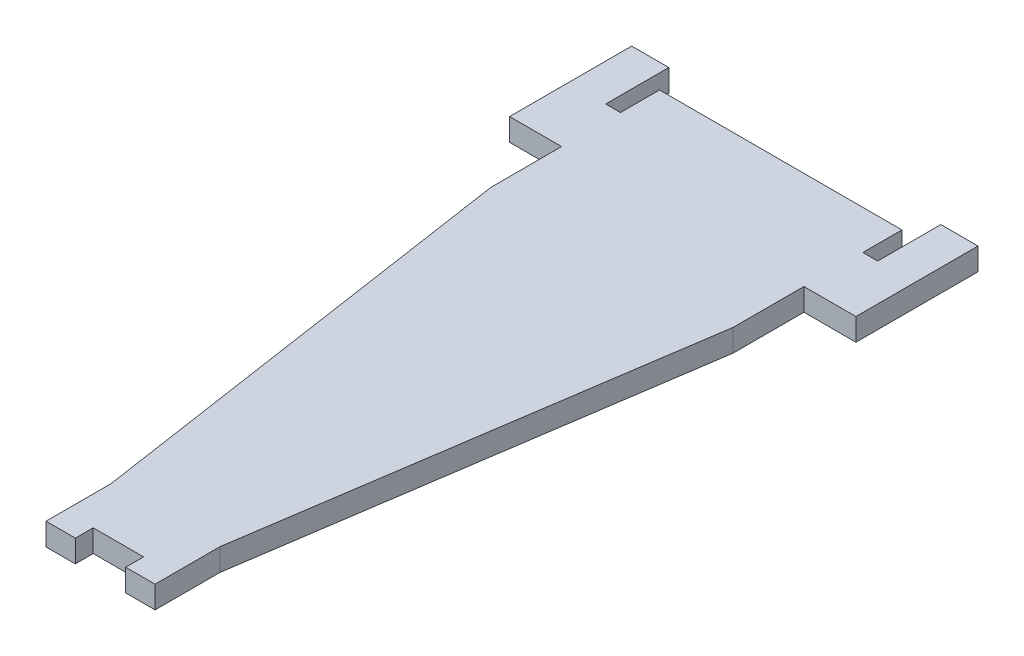
ISO-10303-21;
HEADER;
FILE_DESCRIPTION(('STEP AP214'),'2;1');
FILE_NAME('part.step','',(''),(''),'','','');
FILE_SCHEMA(('AUTOMOTIVE_DESIGN { 1 0 10303 214 1 1 1 1 }'));
ENDSEC;
DATA;
#1=APPLICATION_CONTEXT('core data for automotive mechanical design processes');
#2=APPLICATION_PROTOCOL_DEFINITION('international standard','automotive_design',2000,#1);
#3=PRODUCT_CONTEXT('',#1,'mechanical');
#4=PRODUCT('Part','Part','',(#3));
#5=PRODUCT_RELATED_PRODUCT_CATEGORY('part','',(#4));
#6=PRODUCT_DEFINITION_FORMATION('','',#4);
#7=PRODUCT_DEFINITION_CONTEXT('part definition',#1,'design');
#8=PRODUCT_DEFINITION('design','',#6,#7);
#9=PRODUCT_DEFINITION_SHAPE('','',#8);
#10=(LENGTH_UNIT() NAMED_UNIT(*) SI_UNIT(.MILLI.,.METRE.));
#11=(NAMED_UNIT(*) PLANE_ANGLE_UNIT() SI_UNIT($,.RADIAN.));
#12=(NAMED_UNIT(*) SI_UNIT($,.STERADIAN.) SOLID_ANGLE_UNIT());
#13=UNCERTAINTY_MEASURE_WITH_UNIT(LENGTH_MEASURE(1.E-05),#10,'distance_accuracy_value','');
#14=(GEOMETRIC_REPRESENTATION_CONTEXT(3) GLOBAL_UNCERTAINTY_ASSIGNED_CONTEXT((#13)) GLOBAL_UNIT_ASSIGNED_CONTEXT((#10,
#11,#12)) REPRESENTATION_CONTEXT('',''));
#15=CARTESIAN_POINT('',(0.,0.,0.));
#16=DIRECTION('',(0.,0.,1.));
#17=DIRECTION('',(1.,0.,0.));
#18=AXIS2_PLACEMENT_3D('',#15,#16,#17);
#19=CARTESIAN_POINT('',(65.7711044655571,0.35,-124.980144878676));
#20=DIRECTION('',(-1.,0.,0.));
#21=DIRECTION('',(0.,0.,1.));
#22=AXIS2_PLACEMENT_3D('',#19,#20,#21);
#23=PLANE('',#22);
#24=DIRECTION('',(0.,0.,-1.));
#25=VECTOR('',#24,1.);
#26=CARTESIAN_POINT('',(65.7711044655571,0.,-124.980144878676));
#27=LINE('',#26,#25);
#28=CARTESIAN_POINT('',(65.7711044655571,0.,-124.980144878676));
#29=VERTEX_POINT('',#28);
#30=CARTESIAN_POINT('',(65.7711044655571,0.,-125.998516086058));
#31=VERTEX_POINT('',#30);
#32=EDGE_CURVE('E276',#29,#31,#27,.T.);
#33=ORIENTED_EDGE('',*,*,#32,.T.);
#34=DIRECTION('',(0.,-1.,0.));
#35=VECTOR('',#34,1.);
#36=CARTESIAN_POINT('',(65.7711044655571,0.35,-125.998516086058));
#37=LINE('',#36,#35);
#38=CARTESIAN_POINT('',(65.7711044655571,0.35,-125.998516086058));
#39=VERTEX_POINT('',#38);
#40=EDGE_CURVE('E11',#39,#31,#37,.T.);
#41=ORIENTED_EDGE('',*,*,#40,.F.);
#42=DIRECTION('',(0.,0.,-1.));
#43=VECTOR('',#42,1.);
#44=CARTESIAN_POINT('',(65.7711044655571,0.35,-124.980144878676));
#45=LINE('',#44,#43);
#46=CARTESIAN_POINT('',(65.7711044655571,0.35,-124.980144878676));
#47=VERTEX_POINT('',#46);
#48=EDGE_CURVE('E341',#47,#39,#45,.T.);
#49=ORIENTED_EDGE('',*,*,#48,.F.);
#50=DIRECTION('',(0.,-1.,0.));
#51=VECTOR('',#50,1.);
#52=CARTESIAN_POINT('',(65.7711044655571,0.35,-124.980144878676));
#53=LINE('',#52,#51);
#54=EDGE_CURVE('E272',#47,#29,#53,.T.);
#55=ORIENTED_EDGE('',*,*,#54,.T.);
#56=EDGE_LOOP('',(#33,#41,#49,#55));
#57=FACE_BOUND('',#56,.T.);
#58=ADVANCED_FACE('F40',(#57),#23,.F.);
#59=CARTESIAN_POINT('',(65.7711044655571,0.35,-125.998516086058));
#60=DIRECTION('',(-0.989039748237034,0.,-0.147649505272537));
#61=DIRECTION('',(-0.147649505272537,0.,0.989039748237034));
#62=AXIS2_PLACEMENT_3D('',#59,#60,#61);
#63=PLANE('',#62);
#64=DIRECTION('',(0.147649505272537,0.,-0.989039748237034));
#65=VECTOR('',#64,1.);
#66=CARTESIAN_POINT('',(65.7711044655571,0.,-125.998516086058));
#67=LINE('',#66,#65);
#68=CARTESIAN_POINT('',(66.8161044655571,0.,-132.998516086058));
#69=VERTEX_POINT('',#68);
#70=EDGE_CURVE('E280',#31,#69,#67,.T.);
#71=ORIENTED_EDGE('',*,*,#70,.T.);
#72=DIRECTION('',(0.,-1.,0.));
#73=VECTOR('',#72,1.);
#74=CARTESIAN_POINT('',(66.8161044655571,0.35,-132.998516086058));
#75=LINE('',#74,#73);
#76=CARTESIAN_POINT('',(66.8161044655571,0.35,-132.998516086058));
#77=VERTEX_POINT('',#76);
#78=EDGE_CURVE('E49',#77,#69,#75,.T.);
#79=ORIENTED_EDGE('',*,*,#78,.F.);
#80=DIRECTION('',(0.147649505272537,0.,-0.989039748237034));
#81=VECTOR('',#80,1.);
#82=CARTESIAN_POINT('',(65.7711044655571,0.35,-125.998516086058));
#83=LINE('',#82,#81);
#84=EDGE_CURVE('E171',#39,#77,#83,.T.);
#85=ORIENTED_EDGE('',*,*,#84,.F.);
#86=ORIENTED_EDGE('',*,*,#40,.T.);
#87=EDGE_LOOP('',(#71,#79,#85,#86));
#88=FACE_BOUND('',#87,.T.);
#89=ADVANCED_FACE('F494',(#88),#63,.F.);
#90=CARTESIAN_POINT('',(66.8161044655571,0.35,-134.108516086058));
#91=DIRECTION('',(-1.,0.,0.));
#92=DIRECTION('',(0.,0.,1.));
#93=AXIS2_PLACEMENT_3D('',#90,#91,#92);
#94=PLANE('',#93);
#95=DIRECTION('',(0.,0.,-1.));
#96=VECTOR('',#95,1.);
#97=CARTESIAN_POINT('',(66.8161044655571,0.,-134.108516086058));
#98=LINE('',#97,#96);
#99=CARTESIAN_POINT('',(66.8161044655571,0.,-134.108516086058));
#100=VERTEX_POINT('',#99);
#101=EDGE_CURVE('E283',#69,#100,#98,.T.);
#102=ORIENTED_EDGE('',*,*,#101,.T.);
#103=DIRECTION('',(0.,-1.,0.));
#104=VECTOR('',#103,1.);
#105=CARTESIAN_POINT('',(66.8161044655571,0.35,-134.108516086058));
#106=LINE('',#105,#104);
#107=CARTESIAN_POINT('',(66.8161044655571,0.35,-134.108516086058));
#108=VERTEX_POINT('',#107);
#109=EDGE_CURVE('E411',#108,#100,#106,.T.);
#110=ORIENTED_EDGE('',*,*,#109,.F.);
#111=DIRECTION('',(0.,0.,-1.));
#112=VECTOR('',#111,1.);
#113=CARTESIAN_POINT('',(66.8161044655571,0.35,-134.108516086058));
#114=LINE('',#113,#112);
#115=EDGE_CURVE('E421',#77,#108,#114,.T.);
#116=ORIENTED_EDGE('',*,*,#115,.F.);
#117=ORIENTED_EDGE('',*,*,#78,.T.);
#118=EDGE_LOOP('',(#102,#110,#116,#117));
#119=FACE_BOUND('',#118,.T.);
#120=ADVANCED_FACE('F419',(#119),#94,.F.);
#121=CARTESIAN_POINT('',(66.8161044655571,0.35,-134.108516086058));
#122=DIRECTION('',(0.,0.,-1.));
#123=DIRECTION('',(-1.,0.,0.));
#124=AXIS2_PLACEMENT_3D('',#121,#122,#123);
#125=PLANE('',#124);
#126=DIRECTION('',(1.,0.,0.));
#127=VECTOR('',#126,1.);
#128=CARTESIAN_POINT('',(66.8161044655571,0.,-134.108516086058));
#129=LINE('',#128,#127);
#130=CARTESIAN_POINT('',(67.6310057872198,0.,-134.108516086058));
#131=VERTEX_POINT('',#130);
#132=EDGE_CURVE('E286',#100,#131,#129,.T.);
#133=ORIENTED_EDGE('',*,*,#132,.T.);
#134=DIRECTION('',(0.,-1.,0.));
#135=VECTOR('',#134,1.);
#136=CARTESIAN_POINT('',(67.6310057872198,0.35,-134.108516086058));
#137=LINE('',#136,#135);
#138=CARTESIAN_POINT('',(67.6310057872198,0.35,-134.108516086058));
#139=VERTEX_POINT('',#138);
#140=EDGE_CURVE('E407',#139,#131,#137,.T.);
#141=ORIENTED_EDGE('',*,*,#140,.F.);
#142=DIRECTION('',(1.,0.,0.));
#143=VECTOR('',#142,1.);
#144=CARTESIAN_POINT('',(66.8161044655571,0.35,-134.108516086058));
#145=LINE('',#144,#143);
#146=EDGE_CURVE('E440',#108,#139,#145,.T.);
#147=ORIENTED_EDGE('',*,*,#146,.F.);
#148=ORIENTED_EDGE('',*,*,#109,.T.);
#149=EDGE_LOOP('',(#133,#141,#147,#148));
#150=FACE_BOUND('',#149,.T.);
#151=ADVANCED_FACE('F430',(#150),#125,.F.);
#152=CARTESIAN_POINT('',(67.6310057872198,0.35,-136.022566647931));
#153=DIRECTION('',(-1.,0.,0.));
#154=DIRECTION('',(0.,0.,1.));
#155=AXIS2_PLACEMENT_3D('',#152,#153,#154);
#156=PLANE('',#155);
#157=DIRECTION('',(0.,0.,-1.));
#158=VECTOR('',#157,1.);
#159=CARTESIAN_POINT('',(67.6310057872198,0.,-136.022566647931));
#160=LINE('',#159,#158);
#161=CARTESIAN_POINT('',(67.6310057872198,0.,-136.022566647931));
#162=VERTEX_POINT('',#161);
#163=EDGE_CURVE('E289',#131,#162,#160,.T.);
#164=ORIENTED_EDGE('',*,*,#163,.T.);
#165=DIRECTION('',(0.,-1.,0.));
#166=VECTOR('',#165,1.);
#167=CARTESIAN_POINT('',(67.6310057872198,0.35,-136.022566647931));
#168=LINE('',#167,#166);
#169=CARTESIAN_POINT('',(67.6310057872198,0.35,-136.022566647931));
#170=VERTEX_POINT('',#169);
#171=EDGE_CURVE('E403',#170,#162,#168,.T.);
#172=ORIENTED_EDGE('',*,*,#171,.F.);
#173=DIRECTION('',(0.,0.,-1.));
#174=VECTOR('',#173,1.);
#175=CARTESIAN_POINT('',(67.6310057872198,0.35,-136.022566647931));
#176=LINE('',#175,#174);
#177=EDGE_CURVE('E436',#139,#170,#176,.T.);
#178=ORIENTED_EDGE('',*,*,#177,.F.);
#179=ORIENTED_EDGE('',*,*,#140,.T.);
#180=EDGE_LOOP('',(#164,#172,#178,#179));
#181=FACE_BOUND('',#180,.T.);
#182=ADVANCED_FACE('F434',(#181),#156,.F.);
#183=CARTESIAN_POINT('',(67.0486280438197,0.35,-136.022566647931));
#184=DIRECTION('',(0.,0.,1.));
#185=DIRECTION('',(1.,0.,0.));
#186=AXIS2_PLACEMENT_3D('',#183,#184,#185);
#187=PLANE('',#186);
#188=DIRECTION('',(-1.,0.,0.));
#189=VECTOR('',#188,1.);
#190=CARTESIAN_POINT('',(67.0486280438197,0.,-136.022566647931));
#191=LINE('',#190,#189);
#192=CARTESIAN_POINT('',(67.0486280438197,0.,-136.022566647931));
#193=VERTEX_POINT('',#192);
#194=EDGE_CURVE('E292',#162,#193,#191,.T.);
#195=ORIENTED_EDGE('',*,*,#194,.T.);
#196=DIRECTION('',(0.,-1.,0.));
#197=VECTOR('',#196,1.);
#198=CARTESIAN_POINT('',(67.0486280438197,0.35,-136.022566647931));
#199=LINE('',#198,#197);
#200=CARTESIAN_POINT('',(67.0486280438197,0.35,-136.022566647931));
#201=VERTEX_POINT('',#200);
#202=EDGE_CURVE('E399',#201,#193,#199,.T.);
#203=ORIENTED_EDGE('',*,*,#202,.F.);
#204=DIRECTION('',(-1.,0.,0.));
#205=VECTOR('',#204,1.);
#206=CARTESIAN_POINT('',(67.0486280438197,0.35,-136.022566647931));
#207=LINE('',#206,#205);
#208=EDGE_CURVE('E439',#170,#201,#207,.T.);
#209=ORIENTED_EDGE('',*,*,#208,.F.);
#210=ORIENTED_EDGE('',*,*,#171,.T.);
#211=EDGE_LOOP('',(#195,#203,#209,#210));
#212=FACE_BOUND('',#211,.T.);
#213=ADVANCED_FACE('F506',(#212),#187,.F.);
#214=CARTESIAN_POINT('',(67.0486280438197,0.35,-135.031947543574));
#215=DIRECTION('',(1.,0.,0.));
#216=DIRECTION('',(0.,0.,-1.));
#217=AXIS2_PLACEMENT_3D('',#214,#215,#216);
#218=PLANE('',#217);
#219=DIRECTION('',(0.,0.,1.));
#220=VECTOR('',#219,1.);
#221=CARTESIAN_POINT('',(67.0486280438197,0.,-135.031947543574));
#222=LINE('',#221,#220);
#223=CARTESIAN_POINT('',(67.0486280438197,0.,-135.031947543574));
#224=VERTEX_POINT('',#223);
#225=EDGE_CURVE('E295',#193,#224,#222,.T.);
#226=ORIENTED_EDGE('',*,*,#225,.T.);
#227=DIRECTION('',(0.,-1.,0.));
#228=VECTOR('',#227,1.);
#229=CARTESIAN_POINT('',(67.0486280438197,0.35,-135.031947543574));
#230=LINE('',#229,#228);
#231=CARTESIAN_POINT('',(67.0486280438197,0.35,-135.031947543574));
#232=VERTEX_POINT('',#231);
#233=EDGE_CURVE('E395',#232,#224,#230,.T.);
#234=ORIENTED_EDGE('',*,*,#233,.F.);
#235=DIRECTION('',(0.,0.,1.));
#236=VECTOR('',#235,1.);
#237=CARTESIAN_POINT('',(67.0486280438197,0.35,-135.031947543574));
#238=LINE('',#237,#236);
#239=EDGE_CURVE('E444',#201,#232,#238,.T.);
#240=ORIENTED_EDGE('',*,*,#239,.F.);
#241=ORIENTED_EDGE('',*,*,#202,.T.);
#242=EDGE_LOOP('',(#226,#234,#240,#241));
#243=FACE_BOUND('',#242,.T.);
#244=ADVANCED_FACE('F509',(#243),#218,.F.);
#245=CARTESIAN_POINT('',(66.8161044655571,0.35,-135.031947543574));
#246=DIRECTION('',(0.,0.,1.));
#247=DIRECTION('',(1.,0.,0.));
#248=AXIS2_PLACEMENT_3D('',#245,#246,#247);
#249=PLANE('',#248);
#250=DIRECTION('',(-1.,0.,0.));
#251=VECTOR('',#250,1.);
#252=CARTESIAN_POINT('',(66.8161044655571,0.,-135.031947543574));
#253=LINE('',#252,#251);
#254=CARTESIAN_POINT('',(66.8161044655571,0.,-135.031947543574));
#255=VERTEX_POINT('',#254);
#256=EDGE_CURVE('E298',#224,#255,#253,.T.);
#257=ORIENTED_EDGE('',*,*,#256,.T.);
#258=DIRECTION('',(0.,-1.,0.));
#259=VECTOR('',#258,1.);
#260=CARTESIAN_POINT('',(66.8161044655571,0.35,-135.031947543574));
#261=LINE('',#260,#259);
#262=CARTESIAN_POINT('',(66.8161044655571,0.35,-135.031947543574));
#263=VERTEX_POINT('',#262);
#264=EDGE_CURVE('E391',#263,#255,#261,.T.);
#265=ORIENTED_EDGE('',*,*,#264,.F.);
#266=DIRECTION('',(-1.,0.,0.));
#267=VECTOR('',#266,1.);
#268=CARTESIAN_POINT('',(66.8161044655571,0.35,-135.031947543574));
#269=LINE('',#268,#267);
#270=EDGE_CURVE('E451',#232,#263,#269,.T.);
#271=ORIENTED_EDGE('',*,*,#270,.F.);
#272=ORIENTED_EDGE('',*,*,#233,.T.);
#273=EDGE_LOOP('',(#257,#265,#271,#272));
#274=FACE_BOUND('',#273,.T.);
#275=ADVANCED_FACE('F513',(#274),#249,.F.);
#276=CARTESIAN_POINT('',(66.8161044655571,0.35,-135.644718333563));
#277=DIRECTION('',(-1.,0.,0.));
#278=DIRECTION('',(0.,0.,1.));
#279=AXIS2_PLACEMENT_3D('',#276,#277,#278);
#280=PLANE('',#279);
#281=DIRECTION('',(0.,0.,-1.));
#282=VECTOR('',#281,1.);
#283=CARTESIAN_POINT('',(66.8161044655571,0.,-135.644718333563));
#284=LINE('',#283,#282);
#285=CARTESIAN_POINT('',(66.8161044655571,0.,-135.644718333563));
#286=VERTEX_POINT('',#285);
#287=EDGE_CURVE('E301',#255,#286,#284,.T.);
#288=ORIENTED_EDGE('',*,*,#287,.T.);
#289=DIRECTION('',(0.,-1.,0.));
#290=VECTOR('',#289,1.);
#291=CARTESIAN_POINT('',(66.8161044655571,0.35,-135.644718333563));
#292=LINE('',#291,#290);
#293=CARTESIAN_POINT('',(66.8161044655571,0.35,-135.644718333563));
#294=VERTEX_POINT('',#293);
#295=EDGE_CURVE('E387',#294,#286,#292,.T.);
#296=ORIENTED_EDGE('',*,*,#295,.F.);
#297=DIRECTION('',(0.,0.,-1.));
#298=VECTOR('',#297,1.);
#299=CARTESIAN_POINT('',(66.8161044655571,0.35,-135.644718333563));
#300=LINE('',#299,#298);
#301=EDGE_CURVE('E454',#263,#294,#300,.T.);
#302=ORIENTED_EDGE('',*,*,#301,.F.);
#303=ORIENTED_EDGE('',*,*,#264,.T.);
#304=EDGE_LOOP('',(#288,#296,#302,#303));
#305=FACE_BOUND('',#304,.T.);
#306=ADVANCED_FACE('F517',(#305),#280,.F.);
#307=CARTESIAN_POINT('',(63.0161044655571,0.35,-135.644718333563));
#308=DIRECTION('',(0.,0.,1.));
#309=DIRECTION('',(1.,0.,0.));
#310=AXIS2_PLACEMENT_3D('',#307,#308,#309);
#311=PLANE('',#310);
#312=DIRECTION('',(-1.,0.,0.));
#313=VECTOR('',#312,1.);
#314=CARTESIAN_POINT('',(63.0161044655571,0.,-135.644718333563));
#315=LINE('',#314,#313);
#316=CARTESIAN_POINT('',(63.0161044655571,0.,-135.644718333563));
#317=VERTEX_POINT('',#316);
#318=EDGE_CURVE('E304',#286,#317,#315,.T.);
#319=ORIENTED_EDGE('',*,*,#318,.T.);
#320=DIRECTION('',(0.,-1.,0.));
#321=VECTOR('',#320,1.);
#322=CARTESIAN_POINT('',(63.0161044655571,0.35,-135.644718333563));
#323=LINE('',#322,#321);
#324=CARTESIAN_POINT('',(63.0161044655571,0.35,-135.644718333563));
#325=VERTEX_POINT('',#324);
#326=EDGE_CURVE('E384',#325,#317,#323,.T.);
#327=ORIENTED_EDGE('',*,*,#326,.F.);
#328=DIRECTION('',(-1.,0.,0.));
#329=VECTOR('',#328,1.);
#330=CARTESIAN_POINT('',(63.0161044655571,0.35,-135.644718333563));
#331=LINE('',#330,#329);
#332=EDGE_CURVE('E457',#294,#325,#331,.T.);
#333=ORIENTED_EDGE('',*,*,#332,.F.);
#334=ORIENTED_EDGE('',*,*,#295,.T.);
#335=EDGE_LOOP('',(#319,#327,#333,#334));
#336=FACE_BOUND('',#335,.T.);
#337=ADVANCED_FACE('F521',(#336),#311,.F.);
#338=CARTESIAN_POINT('',(63.0161044655571,0.35,-135.031947543574));
#339=DIRECTION('',(1.,0.,0.));
#340=DIRECTION('',(0.,0.,-1.));
#341=AXIS2_PLACEMENT_3D('',#338,#339,#340);
#342=PLANE('',#341);
#343=DIRECTION('',(0.,0.,1.));
#344=VECTOR('',#343,1.);
#345=CARTESIAN_POINT('',(63.0161044655571,0.,-135.031947543574));
#346=LINE('',#345,#344);
#347=CARTESIAN_POINT('',(63.0161044655571,0.,-135.031947543574));
#348=VERTEX_POINT('',#347);
#349=EDGE_CURVE('E307',#317,#348,#346,.T.);
#350=ORIENTED_EDGE('',*,*,#349,.T.);
#351=DIRECTION('',(0.,-1.,0.));
#352=VECTOR('',#351,1.);
#353=CARTESIAN_POINT('',(63.0161044655571,0.35,-135.031947543574));
#354=LINE('',#353,#352);
#355=CARTESIAN_POINT('',(63.0161044655571,0.35,-135.031947543574));
#356=VERTEX_POINT('',#355);
#357=EDGE_CURVE('E381',#356,#348,#354,.T.);
#358=ORIENTED_EDGE('',*,*,#357,.F.);
#359=DIRECTION('',(0.,0.,1.));
#360=VECTOR('',#359,1.);
#361=CARTESIAN_POINT('',(63.0161044655571,0.35,-135.031947543574));
#362=LINE('',#361,#360);
#363=EDGE_CURVE('E460',#325,#356,#362,.T.);
#364=ORIENTED_EDGE('',*,*,#363,.F.);
#365=ORIENTED_EDGE('',*,*,#326,.T.);
#366=EDGE_LOOP('',(#350,#358,#364,#365));
#367=FACE_BOUND('',#366,.T.);
#368=ADVANCED_FACE('F525',(#367),#342,.F.);
#369=CARTESIAN_POINT('',(62.7835808872946,0.35,-135.031947543574));
#370=DIRECTION('',(0.,0.,1.));
#371=DIRECTION('',(1.,0.,0.));
#372=AXIS2_PLACEMENT_3D('',#369,#370,#371);
#373=PLANE('',#372);
#374=DIRECTION('',(-1.,0.,0.));
#375=VECTOR('',#374,1.);
#376=CARTESIAN_POINT('',(62.7835808872946,0.,-135.031947543574));
#377=LINE('',#376,#375);
#378=CARTESIAN_POINT('',(62.7835808872946,0.,-135.031947543574));
#379=VERTEX_POINT('',#378);
#380=EDGE_CURVE('E309',#348,#379,#377,.T.);
#381=ORIENTED_EDGE('',*,*,#380,.T.);
#382=DIRECTION('',(0.,-1.,0.));
#383=VECTOR('',#382,1.);
#384=CARTESIAN_POINT('',(62.7835808872946,0.35,-135.031947543574));
#385=LINE('',#384,#383);
#386=CARTESIAN_POINT('',(62.7835808872946,0.35,-135.031947543574));
#387=VERTEX_POINT('',#386);
#388=EDGE_CURVE('E378',#387,#379,#385,.T.);
#389=ORIENTED_EDGE('',*,*,#388,.F.);
#390=DIRECTION('',(-1.,0.,0.));
#391=VECTOR('',#390,1.);
#392=CARTESIAN_POINT('',(62.7835808872946,0.35,-135.031947543574));
#393=LINE('',#392,#391);
#394=EDGE_CURVE('E462',#356,#387,#393,.T.);
#395=ORIENTED_EDGE('',*,*,#394,.F.);
#396=ORIENTED_EDGE('',*,*,#357,.T.);
#397=EDGE_LOOP('',(#381,#389,#395,#396));
#398=FACE_BOUND('',#397,.T.);
#399=ADVANCED_FACE('F529',(#398),#373,.F.);
#400=CARTESIAN_POINT('',(62.7835808872945,0.35,-136.022566647931));
#401=DIRECTION('',(-1.,0.,0.));
#402=DIRECTION('',(0.,0.,1.));
#403=AXIS2_PLACEMENT_3D('',#400,#401,#402);
#404=PLANE('',#403);
#405=DIRECTION('',(0.,0.,-1.));
#406=VECTOR('',#405,1.);
#407=CARTESIAN_POINT('',(62.7835808872945,0.,-136.022566647931));
#408=LINE('',#407,#406);
#409=CARTESIAN_POINT('',(62.7835808872945,0.,-136.022566647931));
#410=VERTEX_POINT('',#409);
#411=EDGE_CURVE('E311',#379,#410,#408,.T.);
#412=ORIENTED_EDGE('',*,*,#411,.T.);
#413=DIRECTION('',(0.,-1.,0.));
#414=VECTOR('',#413,1.);
#415=CARTESIAN_POINT('',(62.7835808872945,0.35,-136.022566647931));
#416=LINE('',#415,#414);
#417=CARTESIAN_POINT('',(62.7835808872945,0.35,-136.022566647931));
#418=VERTEX_POINT('',#417);
#419=EDGE_CURVE('E375',#418,#410,#416,.T.);
#420=ORIENTED_EDGE('',*,*,#419,.F.);
#421=DIRECTION('',(0.,0.,-1.));
#422=VECTOR('',#421,1.);
#423=CARTESIAN_POINT('',(62.7835808872945,0.35,-136.022566647931));
#424=LINE('',#423,#422);
#425=EDGE_CURVE('E464',#387,#418,#424,.T.);
#426=ORIENTED_EDGE('',*,*,#425,.F.);
#427=ORIENTED_EDGE('',*,*,#388,.T.);
#428=EDGE_LOOP('',(#412,#420,#426,#427));
#429=FACE_BOUND('',#428,.T.);
#430=ADVANCED_FACE('F533',(#429),#404,.F.);
#431=CARTESIAN_POINT('',(62.2012031438945,0.35,-136.022566647931));
#432=DIRECTION('',(0.,0.,1.));
#433=DIRECTION('',(1.,0.,0.));
#434=AXIS2_PLACEMENT_3D('',#431,#432,#433);
#435=PLANE('',#434);
#436=DIRECTION('',(-1.,0.,0.));
#437=VECTOR('',#436,1.);
#438=CARTESIAN_POINT('',(62.2012031438945,0.,-136.022566647931));
#439=LINE('',#438,#437);
#440=CARTESIAN_POINT('',(62.2012031438945,0.,-136.022566647931));
#441=VERTEX_POINT('',#440);
#442=EDGE_CURVE('E313',#410,#441,#439,.T.);
#443=ORIENTED_EDGE('',*,*,#442,.T.);
#444=DIRECTION('',(0.,-1.,0.));
#445=VECTOR('',#444,1.);
#446=CARTESIAN_POINT('',(62.2012031438945,0.35,-136.022566647931));
#447=LINE('',#446,#445);
#448=CARTESIAN_POINT('',(62.2012031438945,0.35,-136.022566647931));
#449=VERTEX_POINT('',#448);
#450=EDGE_CURVE('E372',#449,#441,#447,.T.);
#451=ORIENTED_EDGE('',*,*,#450,.F.);
#452=DIRECTION('',(-1.,0.,0.));
#453=VECTOR('',#452,1.);
#454=CARTESIAN_POINT('',(62.2012031438945,0.35,-136.022566647931));
#455=LINE('',#454,#453);
#456=EDGE_CURVE('E466',#418,#449,#455,.T.);
#457=ORIENTED_EDGE('',*,*,#456,.F.);
#458=ORIENTED_EDGE('',*,*,#419,.T.);
#459=EDGE_LOOP('',(#443,#451,#457,#458));
#460=FACE_BOUND('',#459,.T.);
#461=ADVANCED_FACE('F537',(#460),#435,.F.);
#462=CARTESIAN_POINT('',(62.2012031438945,0.35,-136.022566647931));
#463=DIRECTION('',(1.,0.,0.));
#464=DIRECTION('',(0.,0.,-1.));
#465=AXIS2_PLACEMENT_3D('',#462,#463,#464);
#466=PLANE('',#465);
#467=DIRECTION('',(0.,0.,1.));
#468=VECTOR('',#467,1.);
#469=CARTESIAN_POINT('',(62.2012031438945,0.,-136.022566647931));
#470=LINE('',#469,#468);
#471=CARTESIAN_POINT('',(62.2012031438945,0.,-134.108516086058));
#472=VERTEX_POINT('',#471);
#473=EDGE_CURVE('E315',#441,#472,#470,.T.);
#474=ORIENTED_EDGE('',*,*,#473,.T.);
#475=DIRECTION('',(0.,-1.,0.));
#476=VECTOR('',#475,1.);
#477=CARTESIAN_POINT('',(62.2012031438945,0.35,-134.108516086058));
#478=LINE('',#477,#476);
#479=CARTESIAN_POINT('',(62.2012031438945,0.35,-134.108516086058));
#480=VERTEX_POINT('',#479);
#481=EDGE_CURVE('E368',#480,#472,#478,.T.);
#482=ORIENTED_EDGE('',*,*,#481,.F.);
#483=DIRECTION('',(0.,0.,1.));
#484=VECTOR('',#483,1.);
#485=CARTESIAN_POINT('',(62.2012031438945,0.35,-136.022566647931));
#486=LINE('',#485,#484);
#487=EDGE_CURVE('E468',#449,#480,#486,.T.);
#488=ORIENTED_EDGE('',*,*,#487,.F.);
#489=ORIENTED_EDGE('',*,*,#450,.T.);
#490=EDGE_LOOP('',(#474,#482,#488,#489));
#491=FACE_BOUND('',#490,.T.);
#492=ADVANCED_FACE('F541',(#491),#466,.F.);
#493=CARTESIAN_POINT('',(62.2012031438945,0.35,-134.108516086058));
#494=DIRECTION('',(0.,0.,-1.));
#495=DIRECTION('',(-1.,0.,0.));
#496=AXIS2_PLACEMENT_3D('',#493,#494,#495);
#497=PLANE('',#496);
#498=DIRECTION('',(1.,0.,0.));
#499=VECTOR('',#498,1.);
#500=CARTESIAN_POINT('',(62.2012031438945,0.,-134.108516086058));
#501=LINE('',#500,#499);
#502=CARTESIAN_POINT('',(63.0161044655571,0.,-134.108516086058));
#503=VERTEX_POINT('',#502);
#504=EDGE_CURVE('E318',#472,#503,#501,.T.);
#505=ORIENTED_EDGE('',*,*,#504,.T.);
#506=DIRECTION('',(0.,-1.,0.));
#507=VECTOR('',#506,1.);
#508=CARTESIAN_POINT('',(63.0161044655571,0.35,-134.108516086058));
#509=LINE('',#508,#507);
#510=CARTESIAN_POINT('',(63.0161044655571,0.35,-134.108516086058));
#511=VERTEX_POINT('',#510);
#512=EDGE_CURVE('E364',#511,#503,#509,.T.);
#513=ORIENTED_EDGE('',*,*,#512,.F.);
#514=DIRECTION('',(1.,0.,0.));
#515=VECTOR('',#514,1.);
#516=CARTESIAN_POINT('',(62.2012031438945,0.35,-134.108516086058));
#517=LINE('',#516,#515);
#518=EDGE_CURVE('E471',#480,#511,#517,.T.);
#519=ORIENTED_EDGE('',*,*,#518,.F.);
#520=ORIENTED_EDGE('',*,*,#481,.T.);
#521=EDGE_LOOP('',(#505,#513,#519,#520));
#522=FACE_BOUND('',#521,.T.);
#523=ADVANCED_FACE('F545',(#522),#497,.F.);
#524=CARTESIAN_POINT('',(63.0161044655571,0.35,-132.998516086058));
#525=DIRECTION('',(1.,0.,0.));
#526=DIRECTION('',(0.,0.,-1.));
#527=AXIS2_PLACEMENT_3D('',#524,#525,#526);
#528=PLANE('',#527);
#529=DIRECTION('',(0.,0.,1.));
#530=VECTOR('',#529,1.);
#531=CARTESIAN_POINT('',(63.0161044655571,0.,-132.998516086058));
#532=LINE('',#531,#530);
#533=CARTESIAN_POINT('',(63.0161044655571,0.,-132.998516086058));
#534=VERTEX_POINT('',#533);
#535=EDGE_CURVE('E321',#503,#534,#532,.T.);
#536=ORIENTED_EDGE('',*,*,#535,.T.);
#537=DIRECTION('',(0.,-1.,0.));
#538=VECTOR('',#537,1.);
#539=CARTESIAN_POINT('',(63.0161044655571,0.35,-132.998516086058));
#540=LINE('',#539,#538);
#541=CARTESIAN_POINT('',(63.0161044655571,0.35,-132.998516086058));
#542=VERTEX_POINT('',#541);
#543=EDGE_CURVE('E360',#542,#534,#540,.T.);
#544=ORIENTED_EDGE('',*,*,#543,.F.);
#545=DIRECTION('',(0.,0.,1.));
#546=VECTOR('',#545,1.);
#547=CARTESIAN_POINT('',(63.0161044655571,0.35,-132.998516086058));
#548=LINE('',#547,#546);
#549=EDGE_CURVE('E474',#511,#542,#548,.T.);
#550=ORIENTED_EDGE('',*,*,#549,.F.);
#551=ORIENTED_EDGE('',*,*,#512,.T.);
#552=EDGE_LOOP('',(#536,#544,#550,#551));
#553=FACE_BOUND('',#552,.T.);
#554=ADVANCED_FACE('F549',(#553),#528,.F.);
#555=CARTESIAN_POINT('',(63.0161044655571,0.35,-132.998516086058));
#556=DIRECTION('',(0.989039748237034,0.,-0.147649505272537));
#557=DIRECTION('',(-0.147649505272537,0.,-0.989039748237034));
#558=AXIS2_PLACEMENT_3D('',#555,#556,#557);
#559=PLANE('',#558);
#560=DIRECTION('',(0.147649505272537,0.,0.989039748237034));
#561=VECTOR('',#560,1.);
#562=CARTESIAN_POINT('',(63.0161044655571,0.,-132.998516086058));
#563=LINE('',#562,#561);
#564=CARTESIAN_POINT('',(64.0611044655572,0.,-125.998516086058));
#565=VERTEX_POINT('',#564);
#566=EDGE_CURVE('E324',#534,#565,#563,.T.);
#567=ORIENTED_EDGE('',*,*,#566,.T.);
#568=DIRECTION('',(0.,-1.,0.));
#569=VECTOR('',#568,1.);
#570=CARTESIAN_POINT('',(64.0611044655572,0.35,-125.998516086058));
#571=LINE('',#570,#569);
#572=CARTESIAN_POINT('',(64.0611044655572,0.35,-125.998516086058));
#573=VERTEX_POINT('',#572);
#574=EDGE_CURVE('E356',#573,#565,#571,.T.);
#575=ORIENTED_EDGE('',*,*,#574,.F.);
#576=DIRECTION('',(0.147649505272537,0.,0.989039748237034));
#577=VECTOR('',#576,1.);
#578=CARTESIAN_POINT('',(63.0161044655571,0.35,-132.998516086058));
#579=LINE('',#578,#577);
#580=EDGE_CURVE('E477',#542,#573,#579,.T.);
#581=ORIENTED_EDGE('',*,*,#580,.F.);
#582=ORIENTED_EDGE('',*,*,#543,.T.);
#583=EDGE_LOOP('',(#567,#575,#581,#582));
#584=FACE_BOUND('',#583,.T.);
#585=ADVANCED_FACE('F553',(#584),#559,.F.);
#586=CARTESIAN_POINT('',(64.0611044655572,0.35,-125.998516086058));
#587=DIRECTION('',(1.,0.,0.));
#588=DIRECTION('',(0.,0.,-1.));
#589=AXIS2_PLACEMENT_3D('',#586,#587,#588);
#590=PLANE('',#589);
#591=DIRECTION('',(0.,0.,1.));
#592=VECTOR('',#591,1.);
#593=CARTESIAN_POINT('',(64.0611044655572,0.,-125.998516086058));
#594=LINE('',#593,#592);
#595=CARTESIAN_POINT('',(64.0611044655572,0.,-124.980144878676));
#596=VERTEX_POINT('',#595);
#597=EDGE_CURVE('E327',#565,#596,#594,.T.);
#598=ORIENTED_EDGE('',*,*,#597,.T.);
#599=DIRECTION('',(0.,-1.,0.));
#600=VECTOR('',#599,1.);
#601=CARTESIAN_POINT('',(64.0611044655572,0.35,-124.980144878676));
#602=LINE('',#601,#600);
#603=CARTESIAN_POINT('',(64.0611044655572,0.35,-124.980144878676));
#604=VERTEX_POINT('',#603);
#605=EDGE_CURVE('E352',#604,#596,#602,.T.);
#606=ORIENTED_EDGE('',*,*,#605,.F.);
#607=DIRECTION('',(0.,0.,1.));
#608=VECTOR('',#607,1.);
#609=CARTESIAN_POINT('',(64.0611044655572,0.35,-125.998516086058));
#610=LINE('',#609,#608);
#611=EDGE_CURVE('E480',#573,#604,#610,.T.);
#612=ORIENTED_EDGE('',*,*,#611,.F.);
#613=ORIENTED_EDGE('',*,*,#574,.T.);
#614=EDGE_LOOP('',(#598,#606,#612,#613));
#615=FACE_BOUND('',#614,.T.);
#616=ADVANCED_FACE('F557',(#615),#590,.F.);
#617=CARTESIAN_POINT('',(64.0611044655572,0.35,-124.980144878676));
#618=DIRECTION('',(0.,0.,-1.));
#619=DIRECTION('',(-1.,0.,0.));
#620=AXIS2_PLACEMENT_3D('',#617,#618,#619);
#621=PLANE('',#620);
#622=DIRECTION('',(1.,0.,0.));
#623=VECTOR('',#622,1.);
#624=CARTESIAN_POINT('',(64.0611044655572,0.,-124.980144878676));
#625=LINE('',#624,#623);
#626=CARTESIAN_POINT('',(64.5211044655571,0.,-124.980144878676));
#627=VERTEX_POINT('',#626);
#628=EDGE_CURVE('E330',#596,#627,#625,.T.);
#629=ORIENTED_EDGE('',*,*,#628,.T.);
#630=DIRECTION('',(0.,-1.,0.));
#631=VECTOR('',#630,1.);
#632=CARTESIAN_POINT('',(64.5211044655571,0.35,-124.980144878676));
#633=LINE('',#632,#631);
#634=CARTESIAN_POINT('',(64.5211044655571,0.35,-124.980144878676));
#635=VERTEX_POINT('',#634);
#636=EDGE_CURVE('E348',#635,#627,#633,.T.);
#637=ORIENTED_EDGE('',*,*,#636,.F.);
#638=DIRECTION('',(1.,0.,0.));
#639=VECTOR('',#638,1.);
#640=CARTESIAN_POINT('',(64.0611044655572,0.35,-124.980144878676));
#641=LINE('',#640,#639);
#642=EDGE_CURVE('E483',#604,#635,#641,.T.);
#643=ORIENTED_EDGE('',*,*,#642,.F.);
#644=ORIENTED_EDGE('',*,*,#605,.T.);
#645=EDGE_LOOP('',(#629,#637,#643,#644));
#646=FACE_BOUND('',#645,.T.);
#647=ADVANCED_FACE('F561',(#646),#621,.F.);
#648=CARTESIAN_POINT('',(64.5211044655571,0.35,-124.980144878676));
#649=DIRECTION('',(-1.,0.,0.));
#650=DIRECTION('',(0.,0.,1.));
#651=AXIS2_PLACEMENT_3D('',#648,#649,#650);
#652=PLANE('',#651);
#653=DIRECTION('',(0.,0.,-1.));
#654=VECTOR('',#653,1.);
#655=CARTESIAN_POINT('',(64.5211044655571,0.,-124.980144878676));
#656=LINE('',#655,#654);
#657=CARTESIAN_POINT('',(64.5211044655571,0.,-125.260144878678));
#658=VERTEX_POINT('',#657);
#659=EDGE_CURVE('E333',#627,#658,#656,.T.);
#660=ORIENTED_EDGE('',*,*,#659,.T.);
#661=DIRECTION('',(0.,-1.,0.));
#662=VECTOR('',#661,1.);
#663=CARTESIAN_POINT('',(64.5211044655571,0.35,-125.260144878678));
#664=LINE('',#663,#662);
#665=CARTESIAN_POINT('',(64.5211044655571,0.35,-125.260144878678));
#666=VERTEX_POINT('',#665);
#667=EDGE_CURVE('E264',#666,#658,#664,.T.);
#668=ORIENTED_EDGE('',*,*,#667,.F.);
#669=DIRECTION('',(0.,0.,-1.));
#670=VECTOR('',#669,1.);
#671=CARTESIAN_POINT('',(64.5211044655571,0.35,-124.980144878676));
#672=LINE('',#671,#670);
#673=EDGE_CURVE('E253',#635,#666,#672,.T.);
#674=ORIENTED_EDGE('',*,*,#673,.F.);
#675=ORIENTED_EDGE('',*,*,#636,.T.);
#676=EDGE_LOOP('',(#660,#668,#674,#675));
#677=FACE_BOUND('',#676,.T.);
#678=ADVANCED_FACE('F565',(#677),#652,.F.);
#679=CARTESIAN_POINT('',(64.5211044655571,0.35,-125.260144878678));
#680=DIRECTION('',(0.,0.,-1.));
#681=DIRECTION('',(-1.,0.,0.));
#682=AXIS2_PLACEMENT_3D('',#679,#680,#681);
#683=PLANE('',#682);
#684=DIRECTION('',(1.,0.,0.));
#685=VECTOR('',#684,1.);
#686=CARTESIAN_POINT('',(64.5211044655571,0.,-125.260144878678));
#687=LINE('',#686,#685);
#688=CARTESIAN_POINT('',(65.3111044655572,0.,-125.260144878678));
#689=VERTEX_POINT('',#688);
#690=EDGE_CURVE('E262',#658,#689,#687,.T.);
#691=ORIENTED_EDGE('',*,*,#690,.T.);
#692=DIRECTION('',(0.,-1.,0.));
#693=VECTOR('',#692,1.);
#694=CARTESIAN_POINT('',(65.3111044655572,0.35,-125.260144878678));
#695=LINE('',#694,#693);
#696=CARTESIAN_POINT('',(65.3111044655572,0.35,-125.260144878678));
#697=VERTEX_POINT('',#696);
#698=EDGE_CURVE('E259',#697,#689,#695,.T.);
#699=ORIENTED_EDGE('',*,*,#698,.F.);
#700=DIRECTION('',(1.,0.,0.));
#701=VECTOR('',#700,1.);
#702=CARTESIAN_POINT('',(64.5211044655571,0.35,-125.260144878678));
#703=LINE('',#702,#701);
#704=EDGE_CURVE('E247',#666,#697,#703,.T.);
#705=ORIENTED_EDGE('',*,*,#704,.F.);
#706=ORIENTED_EDGE('',*,*,#667,.T.);
#707=EDGE_LOOP('',(#691,#699,#705,#706));
#708=FACE_BOUND('',#707,.T.);
#709=ADVANCED_FACE('F260',(#708),#683,.F.);
#710=CARTESIAN_POINT('',(65.3111044655572,0.35,-125.260144878678));
#711=DIRECTION('',(1.,0.,0.));
#712=DIRECTION('',(0.,0.,-1.));
#713=AXIS2_PLACEMENT_3D('',#710,#711,#712);
#714=PLANE('',#713);
#715=DIRECTION('',(0.,0.,1.));
#716=VECTOR('',#715,1.);
#717=CARTESIAN_POINT('',(65.3111044655572,0.,-125.260144878678));
#718=LINE('',#717,#716);
#719=CARTESIAN_POINT('',(65.3111044655572,0.,-124.980144878676));
#720=VERTEX_POINT('',#719);
#721=EDGE_CURVE('E155',#689,#720,#718,.T.);
#722=ORIENTED_EDGE('',*,*,#721,.T.);
#723=DIRECTION('',(0.,-1.,0.));
#724=VECTOR('',#723,1.);
#725=CARTESIAN_POINT('',(65.3111044655572,0.35,-124.980144878676));
#726=LINE('',#725,#724);
#727=CARTESIAN_POINT('',(65.3111044655572,0.35,-124.980144878676));
#728=VERTEX_POINT('',#727);
#729=EDGE_CURVE('E265',#728,#720,#726,.T.);
#730=ORIENTED_EDGE('',*,*,#729,.F.);
#731=DIRECTION('',(0.,0.,1.));
#732=VECTOR('',#731,1.);
#733=CARTESIAN_POINT('',(65.3111044655572,0.35,-125.260144878678));
#734=LINE('',#733,#732);
#735=EDGE_CURVE('E251',#697,#728,#734,.T.);
#736=ORIENTED_EDGE('',*,*,#735,.F.);
#737=ORIENTED_EDGE('',*,*,#698,.T.);
#738=EDGE_LOOP('',(#722,#730,#736,#737));
#739=FACE_BOUND('',#738,.T.);
#740=ADVANCED_FACE('F267',(#739),#714,.F.);
#741=CARTESIAN_POINT('',(65.3111044655572,0.35,-124.980144878676));
#742=DIRECTION('',(0.,0.,-1.));
#743=DIRECTION('',(-1.,0.,0.));
#744=AXIS2_PLACEMENT_3D('',#741,#742,#743);
#745=PLANE('',#744);
#746=DIRECTION('',(1.,0.,0.));
#747=VECTOR('',#746,1.);
#748=CARTESIAN_POINT('',(65.3111044655572,0.,-124.980144878676));
#749=LINE('',#748,#747);
#750=EDGE_CURVE('E163',#720,#29,#749,.T.);
#751=ORIENTED_EDGE('',*,*,#750,.T.);
#752=ORIENTED_EDGE('',*,*,#54,.F.);
#753=DIRECTION('',(1.,0.,0.));
#754=VECTOR('',#753,1.);
#755=CARTESIAN_POINT('',(65.3111044655572,0.35,-124.980144878676));
#756=LINE('',#755,#754);
#757=EDGE_CURVE('E60',#728,#47,#756,.T.);
#758=ORIENTED_EDGE('',*,*,#757,.F.);
#759=ORIENTED_EDGE('',*,*,#729,.T.);
#760=EDGE_LOOP('',(#751,#752,#758,#759));
#761=FACE_BOUND('',#760,.T.);
#762=ADVANCED_FACE('F574',(#761),#745,.F.);
#763=CARTESIAN_POINT('',(0.,0.35,0.));
#764=DIRECTION('',(0.,-1.,0.));
#765=DIRECTION('',(0.,0.,-1.));
#766=AXIS2_PLACEMENT_3D('',#763,#764,#765);
#767=PLANE('',#766);
#768=ORIENTED_EDGE('',*,*,#48,.T.);
#769=ORIENTED_EDGE('',*,*,#84,.T.);
#770=ORIENTED_EDGE('',*,*,#115,.T.);
#771=ORIENTED_EDGE('',*,*,#146,.T.);
#772=ORIENTED_EDGE('',*,*,#177,.T.);
#773=ORIENTED_EDGE('',*,*,#208,.T.);
#774=ORIENTED_EDGE('',*,*,#239,.T.);
#775=ORIENTED_EDGE('',*,*,#270,.T.);
#776=ORIENTED_EDGE('',*,*,#301,.T.);
#777=ORIENTED_EDGE('',*,*,#332,.T.);
#778=ORIENTED_EDGE('',*,*,#363,.T.);
#779=ORIENTED_EDGE('',*,*,#394,.T.);
#780=ORIENTED_EDGE('',*,*,#425,.T.);
#781=ORIENTED_EDGE('',*,*,#456,.T.);
#782=ORIENTED_EDGE('',*,*,#487,.T.);
#783=ORIENTED_EDGE('',*,*,#518,.T.);
#784=ORIENTED_EDGE('',*,*,#549,.T.);
#785=ORIENTED_EDGE('',*,*,#580,.T.);
#786=ORIENTED_EDGE('',*,*,#611,.T.);
#787=ORIENTED_EDGE('',*,*,#642,.T.);
#788=ORIENTED_EDGE('',*,*,#673,.T.);
#789=ORIENTED_EDGE('',*,*,#704,.T.);
#790=ORIENTED_EDGE('',*,*,#735,.T.);
#791=ORIENTED_EDGE('',*,*,#757,.T.);
#792=EDGE_LOOP('',(#768,#769,#770,#771,#772,#773,#774,#775,#776,#777,#778,#779,#780,#781,#782,
#783,#784,#785,#786,#787,#788,#789,#790,#791));
#793=FACE_BOUND('',#792,.T.);
#794=ADVANCED_FACE('F249',(#793),#767,.F.);
#795=CARTESIAN_POINT('',(0.,0.,0.));
#796=DIRECTION('',(0.,-1.,0.));
#797=DIRECTION('',(0.,0.,-1.));
#798=AXIS2_PLACEMENT_3D('',#795,#796,#797);
#799=PLANE('',#798);
#800=ORIENTED_EDGE('',*,*,#32,.F.);
#801=ORIENTED_EDGE('',*,*,#750,.F.);
#802=ORIENTED_EDGE('',*,*,#721,.F.);
#803=ORIENTED_EDGE('',*,*,#690,.F.);
#804=ORIENTED_EDGE('',*,*,#659,.F.);
#805=ORIENTED_EDGE('',*,*,#628,.F.);
#806=ORIENTED_EDGE('',*,*,#597,.F.);
#807=ORIENTED_EDGE('',*,*,#566,.F.);
#808=ORIENTED_EDGE('',*,*,#535,.F.);
#809=ORIENTED_EDGE('',*,*,#504,.F.);
#810=ORIENTED_EDGE('',*,*,#473,.F.);
#811=ORIENTED_EDGE('',*,*,#442,.F.);
#812=ORIENTED_EDGE('',*,*,#411,.F.);
#813=ORIENTED_EDGE('',*,*,#380,.F.);
#814=ORIENTED_EDGE('',*,*,#349,.F.);
#815=ORIENTED_EDGE('',*,*,#318,.F.);
#816=ORIENTED_EDGE('',*,*,#287,.F.);
#817=ORIENTED_EDGE('',*,*,#256,.F.);
#818=ORIENTED_EDGE('',*,*,#225,.F.);
#819=ORIENTED_EDGE('',*,*,#194,.F.);
#820=ORIENTED_EDGE('',*,*,#163,.F.);
#821=ORIENTED_EDGE('',*,*,#132,.F.);
#822=ORIENTED_EDGE('',*,*,#101,.F.);
#823=ORIENTED_EDGE('',*,*,#70,.F.);
#824=EDGE_LOOP('',(#800,#801,#802,#803,#804,#805,#806,#807,#808,#809,#810,#811,#812,#813,#814,
#815,#816,#817,#818,#819,#820,#821,#822,#823));
#825=FACE_BOUND('',#824,.T.);
#826=ADVANCED_FACE('F425',(#825),#799,.T.);
#827=CLOSED_SHELL('',(#58,#89,#120,#151,#182,#213,#244,#275,#306,#337,#368,#399,#430,#461,#492,
#523,#554,#585,#616,#647,#678,#709,#740,#762,#794,#826));
#828=MANIFOLD_SOLID_BREP('B2',#827);
#829=ADVANCED_BREP_SHAPE_REPRESENTATION('',(#18,#828),#14);
#830=SHAPE_DEFINITION_REPRESENTATION(#9,#829);
ENDSEC;
END-ISO-10303-21;
